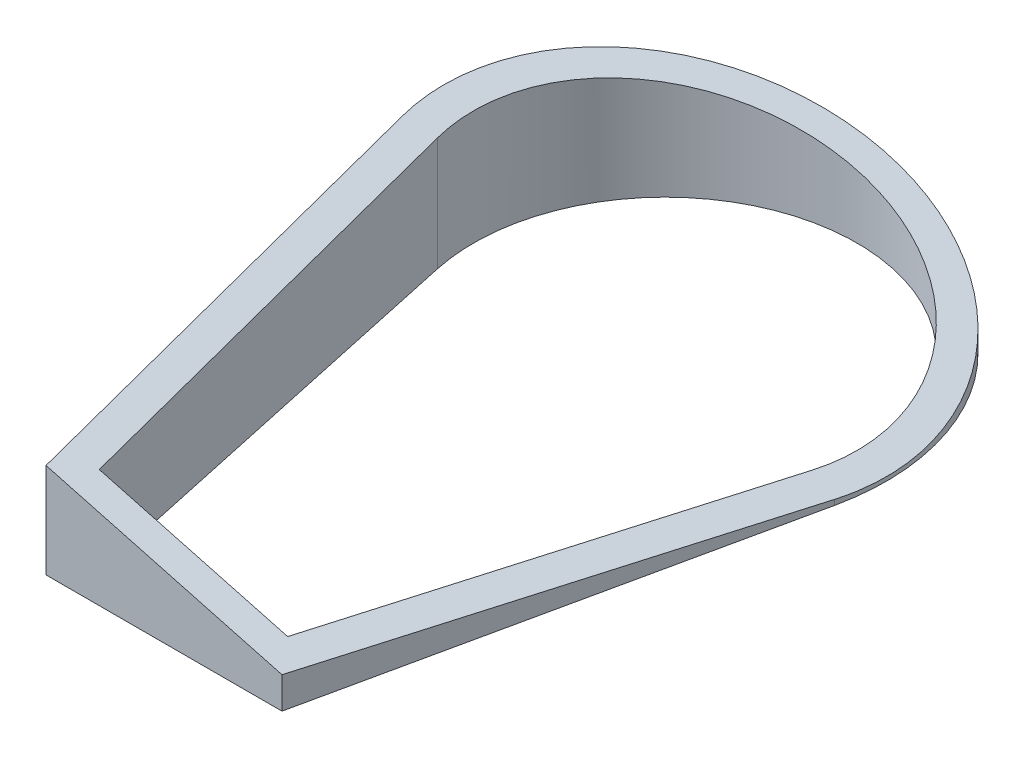
ISO-10303-21;
HEADER;
FILE_DESCRIPTION(('STEP AP214'),'2;1');
FILE_NAME('part.step','',(''),(''),'','','');
FILE_SCHEMA(('AUTOMOTIVE_DESIGN { 1 0 10303 214 1 1 1 1 }'));
ENDSEC;
DATA;
#1=APPLICATION_CONTEXT('core data for automotive mechanical design processes');
#2=APPLICATION_PROTOCOL_DEFINITION('international standard','automotive_design',2000,#1);
#3=PRODUCT_CONTEXT('',#1,'mechanical');
#4=PRODUCT('Part','Part','',(#3));
#5=PRODUCT_RELATED_PRODUCT_CATEGORY('part','',(#4));
#6=PRODUCT_DEFINITION_FORMATION('','',#4);
#7=PRODUCT_DEFINITION_CONTEXT('part definition',#1,'design');
#8=PRODUCT_DEFINITION('design','',#6,#7);
#9=PRODUCT_DEFINITION_SHAPE('','',#8);
#10=(LENGTH_UNIT() NAMED_UNIT(*) SI_UNIT(.MILLI.,.METRE.));
#11=(NAMED_UNIT(*) PLANE_ANGLE_UNIT() SI_UNIT($,.RADIAN.));
#12=(NAMED_UNIT(*) SI_UNIT($,.STERADIAN.) SOLID_ANGLE_UNIT());
#13=UNCERTAINTY_MEASURE_WITH_UNIT(LENGTH_MEASURE(1.E-05),#10,'distance_accuracy_value','');
#14=(GEOMETRIC_REPRESENTATION_CONTEXT(3) GLOBAL_UNCERTAINTY_ASSIGNED_CONTEXT((#13)) GLOBAL_UNIT_ASSIGNED_CONTEXT((#10,
#11,#12)) REPRESENTATION_CONTEXT('',''));
#15=CARTESIAN_POINT('',(0.,0.,0.));
#16=DIRECTION('',(0.,0.,1.));
#17=DIRECTION('',(1.,0.,0.));
#18=AXIS2_PLACEMENT_3D('',#15,#16,#17);
#19=CARTESIAN_POINT('',(0.,0.,0.));
#20=DIRECTION('',(0.,1.,0.));
#21=DIRECTION('',(0.,0.,1.));
#22=AXIS2_PLACEMENT_3D('',#19,#20,#21);
#23=PLANE('',#22);
#24=CARTESIAN_POINT('',(0.,0.,0.));
#25=DIRECTION('',(0.,1.,0.));
#26=DIRECTION('',(0.,0.,1.));
#27=AXIS2_PLACEMENT_3D('',#24,#25,#26);
#28=CIRCLE('',#27,75.);
#29=CARTESIAN_POINT('',(73.31,0.,15.8317371125218));
#30=VERTEX_POINT('',#29);
#31=CARTESIAN_POINT('',(-73.31,0.,15.8317371125218));
#32=VERTEX_POINT('',#31);
#33=EDGE_CURVE('E130',#30,#32,#28,.T.);
#34=ORIENTED_EDGE('',*,*,#33,.F.);
#35=DIRECTION('',(0.211089828166957,0.,-0.977466666666667));
#36=VECTOR('',#35,1.);
#37=CARTESIAN_POINT('',(73.31,0.,15.8317371125218));
#38=LINE('',#37,#36);
#39=CARTESIAN_POINT('',(40.0164328314186,0.,170.));
#40=VERTEX_POINT('',#39);
#41=EDGE_CURVE('E124',#40,#30,#38,.T.);
#42=ORIENTED_EDGE('',*,*,#41,.F.);
#43=DIRECTION('',(1.,0.,0.));
#44=VECTOR('',#43,1.);
#45=CARTESIAN_POINT('',(-40.0164328314186,0.,170.));
#46=LINE('',#45,#44);
#47=CARTESIAN_POINT('',(-40.0164328314186,0.,170.));
#48=VERTEX_POINT('',#47);
#49=EDGE_CURVE('E127',#48,#40,#46,.T.);
#50=ORIENTED_EDGE('',*,*,#49,.F.);
#51=DIRECTION('',(0.211089828166957,0.,0.977466666666667));
#52=VECTOR('',#51,1.);
#53=CARTESIAN_POINT('',(-73.31,0.,15.8317371125218));
#54=LINE('',#53,#52);
#55=EDGE_CURVE('E117',#32,#48,#54,.T.);
#56=ORIENTED_EDGE('',*,*,#55,.F.);
#57=EDGE_LOOP('',(#34,#42,#50,#56));
#58=FACE_BOUND('',#57,.T.);
#59=CARTESIAN_POINT('',(0.,0.,0.));
#60=DIRECTION('',(0.,1.,0.));
#61=DIRECTION('',(0.,0.,1.));
#62=AXIS2_PLACEMENT_3D('',#59,#60,#61);
#63=CIRCLE('',#62,65.);
#64=CARTESIAN_POINT('',(63.5353333333333,0.,13.7208388308522));
#65=VERTEX_POINT('',#64);
#66=CARTESIAN_POINT('',(-63.5353333333333,0.,13.7208388308522));
#67=VERTEX_POINT('',#66);
#68=EDGE_CURVE('E104',#65,#67,#63,.T.);
#69=ORIENTED_EDGE('',*,*,#68,.T.);
#70=DIRECTION('',(0.211089828166957,0.,0.977466666666667));
#71=VECTOR('',#70,1.);
#72=CARTESIAN_POINT('',(-63.5353333333333,0.,13.7208388308522));
#73=LINE('',#72,#71);
#74=CARTESIAN_POINT('',(-31.9454653116425,0.,160.));
#75=VERTEX_POINT('',#74);
#76=EDGE_CURVE('E147',#67,#75,#73,.T.);
#77=ORIENTED_EDGE('',*,*,#76,.T.);
#78=DIRECTION('',(1.,0.,0.));
#79=VECTOR('',#78,1.);
#80=CARTESIAN_POINT('',(-31.9454653116425,0.,160.));
#81=LINE('',#80,#79);
#82=CARTESIAN_POINT('',(31.9454653116425,0.,160.));
#83=VERTEX_POINT('',#82);
#84=EDGE_CURVE('E144',#75,#83,#81,.T.);
#85=ORIENTED_EDGE('',*,*,#84,.T.);
#86=DIRECTION('',(0.211089828166957,0.,-0.977466666666666));
#87=VECTOR('',#86,1.);
#88=CARTESIAN_POINT('',(63.5353333333333,0.,13.7208388308522));
#89=LINE('',#88,#87);
#90=EDGE_CURVE('E141',#83,#65,#89,.T.);
#91=ORIENTED_EDGE('',*,*,#90,.T.);
#92=EDGE_LOOP('',(#69,#77,#85,#91));
#93=FACE_BOUND('',#92,.T.);
#94=ADVANCED_FACE('F35',(#58,#93),#23,.F.);
#95=CARTESIAN_POINT('',(0.,70.,0.));
#96=DIRECTION('',(0.,-1.,0.));
#97=DIRECTION('',(0.,0.,-1.));
#98=AXIS2_PLACEMENT_3D('',#95,#96,#97);
#99=CYLINDRICAL_SURFACE('',#98,75.);
#100=CARTESIAN_POINT('',(0.,21.4359353944899,0.));
#101=DIRECTION('',(-0.258819045102521,-0.965925826289068,0.));
#102=DIRECTION('',(0.965925826289068,-0.258819045102521,0.));
#103=AXIS2_PLACEMENT_3D('',#100,#101,#102);
#104=ELLIPSE('',#103,77.6457135307562,75.);
#105=CARTESIAN_POINT('',(-73.31,41.0792906916155,15.8317371125218));
#106=VERTEX_POINT('',#105);
#107=CARTESIAN_POINT('',(73.31,1.79258009736423,15.8317371125218));
#108=VERTEX_POINT('',#107);
#109=EDGE_CURVE('E100',#106,#108,#104,.T.);
#110=ORIENTED_EDGE('',*,*,#109,.T.);
#111=DIRECTION('',(0.,-1.,0.));
#112=VECTOR('',#111,1.);
#113=CARTESIAN_POINT('',(73.31,70.,15.8317371125218));
#114=LINE('',#113,#112);
#115=EDGE_CURVE('E120',#108,#30,#114,.T.);
#116=ORIENTED_EDGE('',*,*,#115,.T.);
#117=ORIENTED_EDGE('',*,*,#33,.T.);
#118=DIRECTION('',(0.,-1.,0.));
#119=VECTOR('',#118,1.);
#120=CARTESIAN_POINT('',(-73.31,70.,15.8317371125218));
#121=LINE('',#120,#119);
#122=EDGE_CURVE('E43',#106,#32,#121,.T.);
#123=ORIENTED_EDGE('',*,*,#122,.F.);
#124=EDGE_LOOP('',(#110,#116,#117,#123));
#125=FACE_BOUND('',#124,.T.);
#126=ADVANCED_FACE('F37',(#125),#99,.T.);
#127=CARTESIAN_POINT('',(-73.31,70.,15.8317371125218));
#128=DIRECTION('',(0.977466666666667,0.,-0.211089828166957));
#129=DIRECTION('',(-0.211089828166957,0.,-0.977466666666667));
#130=AXIS2_PLACEMENT_3D('',#127,#128,#129);
#131=PLANE('',#130);
#132=DIRECTION('',(0.,-1.,0.));
#133=VECTOR('',#132,1.);
#134=CARTESIAN_POINT('',(-40.0164328314186,70.,170.));
#135=LINE('',#134,#133);
#136=CARTESIAN_POINT('',(-40.0164328314186,32.1583062556428,170.));
#137=VERTEX_POINT('',#136);
#138=EDGE_CURVE('E110',#137,#48,#135,.T.);
#139=ORIENTED_EDGE('',*,*,#138,.F.);
#140=DIRECTION('',(-0.210752978353239,0.0564710903522045,-0.975906859320946));
#141=VECTOR('',#140,1.);
#142=CARTESIAN_POINT('',(-73.6541983897549,41.1715183721864,14.2379016557055));
#143=LINE('',#142,#141);
#144=EDGE_CURVE('E98',#137,#106,#143,.T.);
#145=ORIENTED_EDGE('',*,*,#144,.T.);
#146=ORIENTED_EDGE('',*,*,#122,.T.);
#147=ORIENTED_EDGE('',*,*,#55,.T.);
#148=EDGE_LOOP('',(#139,#145,#146,#147));
#149=FACE_BOUND('',#148,.T.);
#150=ADVANCED_FACE('F115',(#149),#131,.F.);
#151=CARTESIAN_POINT('',(-40.0164328314186,70.,170.));
#152=DIRECTION('',(0.,0.,-1.));
#153=DIRECTION('',(-1.,0.,0.));
#154=AXIS2_PLACEMENT_3D('',#151,#152,#153);
#155=PLANE('',#154);
#156=DIRECTION('',(0.,-1.,0.));
#157=VECTOR('',#156,1.);
#158=CARTESIAN_POINT('',(40.0164328314186,70.,170.));
#159=LINE('',#158,#157);
#160=CARTESIAN_POINT('',(40.0164328314186,10.713564533337,170.));
#161=VERTEX_POINT('',#160);
#162=EDGE_CURVE('E112',#161,#40,#159,.T.);
#163=ORIENTED_EDGE('',*,*,#162,.F.);
#164=DIRECTION('',(0.965925826289068,-0.258819045102521,0.));
#165=VECTOR('',#164,1.);
#166=CARTESIAN_POINT('',(-80.,42.8718707889797,170.));
#167=LINE('',#166,#165);
#168=EDGE_CURVE('E50',#137,#161,#167,.T.);
#169=ORIENTED_EDGE('',*,*,#168,.F.);
#170=ORIENTED_EDGE('',*,*,#138,.T.);
#171=ORIENTED_EDGE('',*,*,#49,.T.);
#172=EDGE_LOOP('',(#163,#169,#170,#171));
#173=FACE_BOUND('',#172,.T.);
#174=ADVANCED_FACE('F108',(#173),#155,.F.);
#175=CARTESIAN_POINT('',(73.31,70.,15.8317371125218));
#176=DIRECTION('',(-0.977466666666667,0.,-0.211089828166957));
#177=DIRECTION('',(-0.211089828166957,0.,0.977466666666667));
#178=AXIS2_PLACEMENT_3D('',#175,#176,#177);
#179=PLANE('',#178);
#180=ORIENTED_EDGE('',*,*,#115,.F.);
#181=DIRECTION('',(-0.210752978353239,0.0564710903522045,0.975906859320946));
#182=VECTOR('',#181,1.);
#183=CARTESIAN_POINT('',(72.4982327694841,2.01009247122301,19.5906837932402));
#184=LINE('',#183,#182);
#185=EDGE_CURVE('E153',#108,#161,#184,.T.);
#186=ORIENTED_EDGE('',*,*,#185,.T.);
#187=ORIENTED_EDGE('',*,*,#162,.T.);
#188=ORIENTED_EDGE('',*,*,#41,.T.);
#189=EDGE_LOOP('',(#180,#186,#187,#188));
#190=FACE_BOUND('',#189,.T.);
#191=ADVANCED_FACE('F196',(#190),#179,.F.);
#192=CARTESIAN_POINT('',(0.,70.,0.));
#193=DIRECTION('',(0.,-1.,0.));
#194=DIRECTION('',(0.,0.,-1.));
#195=AXIS2_PLACEMENT_3D('',#192,#193,#194);
#196=CYLINDRICAL_SURFACE('',#195,65.);
#197=CARTESIAN_POINT('',(0.,21.4359353944899,0.));
#198=DIRECTION('',(-0.258819045102521,-0.965925826289068,0.));
#199=DIRECTION('',(0.965925826289068,-0.258819045102521,0.));
#200=AXIS2_PLACEMENT_3D('',#197,#198,#199);
#201=ELLIPSE('',#200,67.2929517266554,65.);
#202=CARTESIAN_POINT('',(-63.5353333333333,38.4601766519988,13.7208388308522));
#203=VERTEX_POINT('',#202);
#204=CARTESIAN_POINT('',(63.5353333333333,4.41169413698097,13.7208388308522));
#205=VERTEX_POINT('',#204);
#206=EDGE_CURVE('E57',#203,#205,#201,.T.);
#207=ORIENTED_EDGE('',*,*,#206,.F.);
#208=DIRECTION('',(0.,-1.,0.));
#209=VECTOR('',#208,1.);
#210=CARTESIAN_POINT('',(-63.5353333333333,70.,13.7208388308522));
#211=LINE('',#210,#209);
#212=EDGE_CURVE('E133',#203,#67,#211,.T.);
#213=ORIENTED_EDGE('',*,*,#212,.T.);
#214=ORIENTED_EDGE('',*,*,#68,.F.);
#215=DIRECTION('',(0.,-1.,0.));
#216=VECTOR('',#215,1.);
#217=CARTESIAN_POINT('',(63.5353333333333,70.,13.7208388308522));
#218=LINE('',#217,#216);
#219=EDGE_CURVE('E139',#205,#65,#218,.T.);
#220=ORIENTED_EDGE('',*,*,#219,.F.);
#221=EDGE_LOOP('',(#207,#213,#214,#220));
#222=FACE_BOUND('',#221,.T.);
#223=ADVANCED_FACE('F174',(#222),#196,.F.);
#224=CARTESIAN_POINT('',(-63.5353333333333,70.,13.7208388308522));
#225=DIRECTION('',(0.977466666666667,0.,-0.211089828166957));
#226=DIRECTION('',(-0.211089828166957,0.,-0.977466666666667));
#227=AXIS2_PLACEMENT_3D('',#224,#225,#226);
#228=PLANE('',#227);
#229=DIRECTION('',(-0.21075297835324,0.0564710903522046,-0.975906859320946));
#230=VECTOR('',#229,1.);
#231=CARTESIAN_POINT('',(-63.910702979139,38.5607566454555,11.9826626257758));
#232=LINE('',#231,#230);
#233=CARTESIAN_POINT('',(-31.9454653116425,29.9956970265809,160.));
#234=VERTEX_POINT('',#233);
#235=EDGE_CURVE('E156',#234,#203,#232,.T.);
#236=ORIENTED_EDGE('',*,*,#235,.F.);
#237=DIRECTION('',(0.,-1.,0.));
#238=VECTOR('',#237,1.);
#239=CARTESIAN_POINT('',(-31.9454653116425,70.,160.));
#240=LINE('',#239,#238);
#241=EDGE_CURVE('E135',#234,#75,#240,.T.);
#242=ORIENTED_EDGE('',*,*,#241,.T.);
#243=ORIENTED_EDGE('',*,*,#76,.F.);
#244=ORIENTED_EDGE('',*,*,#212,.F.);
#245=EDGE_LOOP('',(#236,#242,#243,#244));
#246=FACE_BOUND('',#245,.T.);
#247=ADVANCED_FACE('F165',(#246),#228,.T.);
#248=CARTESIAN_POINT('',(-31.9454653116425,70.,160.));
#249=DIRECTION('',(0.,0.,-1.));
#250=DIRECTION('',(-1.,0.,0.));
#251=AXIS2_PLACEMENT_3D('',#248,#249,#250);
#252=PLANE('',#251);
#253=DIRECTION('',(-0.965925826289068,0.258819045102521,0.));
#254=VECTOR('',#253,1.);
#255=CARTESIAN_POINT('',(-41.9465410549973,32.6754771954554,160.));
#256=LINE('',#255,#254);
#257=CARTESIAN_POINT('',(31.9454653116425,12.8761737623988,160.));
#258=VERTEX_POINT('',#257);
#259=EDGE_CURVE('E113',#258,#234,#256,.T.);
#260=ORIENTED_EDGE('',*,*,#259,.F.);
#261=DIRECTION('',(0.,-1.,0.));
#262=VECTOR('',#261,1.);
#263=CARTESIAN_POINT('',(31.9454653116425,70.,160.));
#264=LINE('',#263,#262);
#265=EDGE_CURVE('E137',#258,#83,#264,.T.);
#266=ORIENTED_EDGE('',*,*,#265,.T.);
#267=ORIENTED_EDGE('',*,*,#84,.F.);
#268=ORIENTED_EDGE('',*,*,#241,.F.);
#269=EDGE_LOOP('',(#260,#266,#267,#268));
#270=FACE_BOUND('',#269,.T.);
#271=ADVANCED_FACE('F168',(#270),#252,.T.);
#272=CARTESIAN_POINT('',(63.5353333333333,70.,13.7208388308522));
#273=DIRECTION('',(-0.977466666666667,0.,-0.211089828166957));
#274=DIRECTION('',(-0.211089828166957,0.,0.977466666666667));
#275=AXIS2_PLACEMENT_3D('',#272,#273,#274);
#276=PLANE('',#275);
#277=DIRECTION('',(-0.21075297835324,0.0564710903522046,0.975906859320946));
#278=VECTOR('',#277,1.);
#279=CARTESIAN_POINT('',(62.7547373588682,4.6208541979539,17.3354447633105));
#280=LINE('',#279,#278);
#281=EDGE_CURVE('E11',#205,#258,#280,.T.);
#282=ORIENTED_EDGE('',*,*,#281,.F.);
#283=ORIENTED_EDGE('',*,*,#219,.T.);
#284=ORIENTED_EDGE('',*,*,#90,.F.);
#285=ORIENTED_EDGE('',*,*,#265,.F.);
#286=EDGE_LOOP('',(#282,#283,#284,#285));
#287=FACE_BOUND('',#286,.T.);
#288=ADVANCED_FACE('F176',(#287),#276,.T.);
#289=CARTESIAN_POINT('',(-80.,42.8718707889797,-75.));
#290=DIRECTION('',(-0.258819045102521,-0.965925826289068,0.));
#291=DIRECTION('',(0.965925826289068,-0.258819045102521,0.));
#292=AXIS2_PLACEMENT_3D('',#289,#290,#291);
#293=PLANE('',#292);
#294=ORIENTED_EDGE('',*,*,#206,.T.);
#295=ORIENTED_EDGE('',*,*,#281,.T.);
#296=ORIENTED_EDGE('',*,*,#259,.T.);
#297=ORIENTED_EDGE('',*,*,#235,.T.);
#298=EDGE_LOOP('',(#294,#295,#296,#297));
#299=FACE_BOUND('',#298,.T.);
#300=ORIENTED_EDGE('',*,*,#168,.T.);
#301=ORIENTED_EDGE('',*,*,#185,.F.);
#302=ORIENTED_EDGE('',*,*,#109,.F.);
#303=ORIENTED_EDGE('',*,*,#144,.F.);
#304=EDGE_LOOP('',(#300,#301,#302,#303));
#305=FACE_BOUND('',#304,.T.);
#306=ADVANCED_FACE('F99',(#299,#305),#293,.F.);
#307=CLOSED_SHELL('',(#94,#126,#150,#174,#191,#223,#247,#271,#288,#306));
#308=MANIFOLD_SOLID_BREP('B2',#307);
#309=ADVANCED_BREP_SHAPE_REPRESENTATION('',(#18,#308),#14);
#310=SHAPE_DEFINITION_REPRESENTATION(#9,#309);
ENDSEC;
END-ISO-10303-21;
